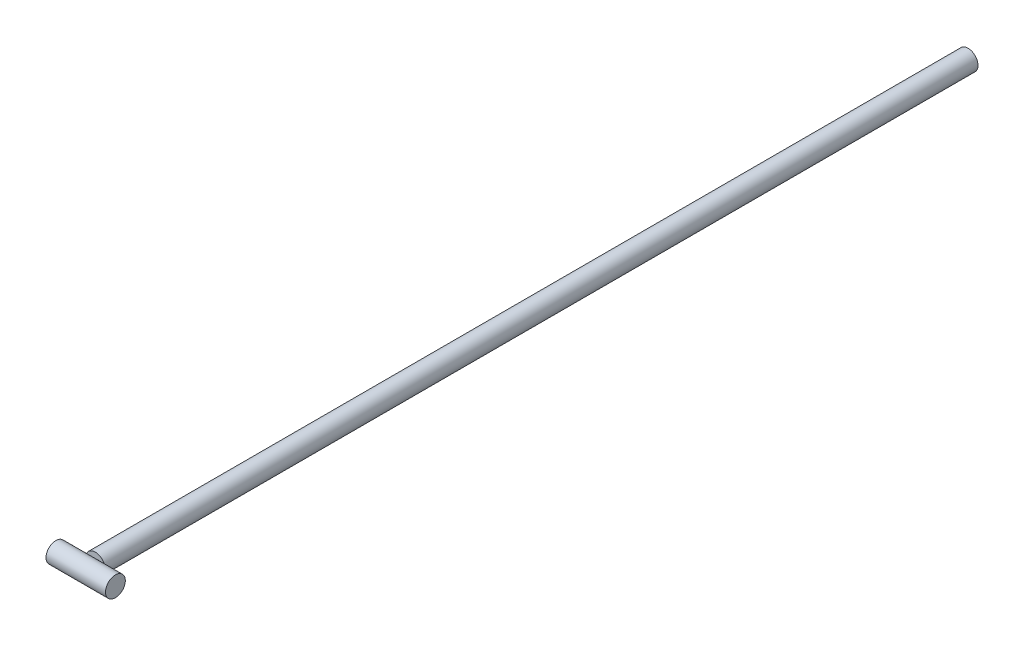
ISO-10303-21;
HEADER;
FILE_DESCRIPTION(('STEP AP214'),'2;1');
FILE_NAME('part.step','',(''),(''),'','','');
FILE_SCHEMA(('AUTOMOTIVE_DESIGN { 1 0 10303 214 1 1 1 1 }'));
ENDSEC;
DATA;
#1=APPLICATION_CONTEXT('core data for automotive mechanical design processes');
#2=APPLICATION_PROTOCOL_DEFINITION('international standard','automotive_design',2000,#1);
#3=PRODUCT_CONTEXT('',#1,'mechanical');
#4=PRODUCT('Part','Part','',(#3));
#5=PRODUCT_RELATED_PRODUCT_CATEGORY('part','',(#4));
#6=PRODUCT_DEFINITION_FORMATION('','',#4);
#7=PRODUCT_DEFINITION_CONTEXT('part definition',#1,'design');
#8=PRODUCT_DEFINITION('design','',#6,#7);
#9=PRODUCT_DEFINITION_SHAPE('','',#8);
#10=(LENGTH_UNIT() NAMED_UNIT(*) SI_UNIT(.MILLI.,.METRE.));
#11=(NAMED_UNIT(*) PLANE_ANGLE_UNIT() SI_UNIT($,.RADIAN.));
#12=(NAMED_UNIT(*) SI_UNIT($,.STERADIAN.) SOLID_ANGLE_UNIT());
#13=UNCERTAINTY_MEASURE_WITH_UNIT(LENGTH_MEASURE(1.E-05),#10,'distance_accuracy_value','');
#14=(GEOMETRIC_REPRESENTATION_CONTEXT(3) GLOBAL_UNCERTAINTY_ASSIGNED_CONTEXT((#13)) GLOBAL_UNIT_ASSIGNED_CONTEXT((#10,
#11,#12)) REPRESENTATION_CONTEXT('',''));
#15=CARTESIAN_POINT('',(0.,0.,0.));
#16=DIRECTION('',(0.,0.,1.));
#17=DIRECTION('',(1.,0.,0.));
#18=AXIS2_PLACEMENT_3D('',#15,#16,#17);
#19=CARTESIAN_POINT('',(0.,0.,110.));
#20=DIRECTION('',(0.,0.,1.));
#21=DIRECTION('',(1.,0.,0.));
#22=AXIS2_PLACEMENT_3D('',#19,#20,#21);
#23=PLANE('',#22);
#24=DIRECTION('',(-1.,0.,0.));
#25=VECTOR('',#24,1.);
#26=CARTESIAN_POINT('',(7.5,-0.542279974485531,110.));
#27=LINE('',#26,#25);
#28=CARTESIAN_POINT('',(2.44047791001516,-0.542279974485531,110.));
#29=VERTEX_POINT('',#28);
#30=CARTESIAN_POINT('',(-2.44047791001516,-0.54227997448554,110.));
#31=VERTEX_POINT('',#30);
#32=EDGE_CURVE('E47',#29,#31,#27,.T.);
#33=ORIENTED_EDGE('',*,*,#32,.T.);
#34=CARTESIAN_POINT('',(0.,0.,110.));
#35=DIRECTION('',(0.,0.,1.));
#36=DIRECTION('',(1.,0.,0.));
#37=AXIS2_PLACEMENT_3D('',#34,#35,#36);
#38=CIRCLE('',#37,2.5);
#39=EDGE_CURVE('E60',#31,#29,#38,.T.);
#40=ORIENTED_EDGE('',*,*,#39,.T.);
#41=EDGE_LOOP('',(#33,#40));
#42=FACE_BOUND('',#41,.T.);
#43=ADVANCED_FACE('F39',(#42),#23,.T.);
#44=CARTESIAN_POINT('',(0.,0.,110.));
#45=DIRECTION('',(0.,0.,-1.));
#46=DIRECTION('',(-1.,0.,0.));
#47=AXIS2_PLACEMENT_3D('',#44,#45,#46);
#48=CYLINDRICAL_SURFACE('',#47,2.5);
#49=CARTESIAN_POINT('',(0.,0.,-110.));
#50=DIRECTION('',(0.,0.,1.));
#51=DIRECTION('',(1.,0.,0.));
#52=AXIS2_PLACEMENT_3D('',#49,#50,#51);
#53=CIRCLE('',#52,2.5);
#54=CARTESIAN_POINT('',(2.5,0.,-110.));
#55=VERTEX_POINT('',#54);
#56=EDGE_CURVE('E79',#55,#55,#53,.T.);
#57=ORIENTED_EDGE('',*,*,#56,.T.);
#58=EDGE_LOOP('',(#57));
#59=FACE_BOUND('',#58,.T.);
#60=ORIENTED_EDGE('',*,*,#39,.F.);
#61=CARTESIAN_POINT('',(0.,0.,112.440477910015));
#62=DIRECTION('',(0.707106781186547,0.,-0.707106781186547));
#63=DIRECTION('',(-0.707106781186547,0.,-0.707106781186547));
#64=AXIS2_PLACEMENT_3D('',#61,#62,#63);
#65=ELLIPSE('',#64,3.53553390593273,2.5);
#66=CARTESIAN_POINT('',(-2.44047791001516,0.542279974485531,110.));
#67=VERTEX_POINT('',#66);
#68=EDGE_CURVE('E68',#31,#67,#65,.T.);
#69=ORIENTED_EDGE('',*,*,#68,.T.);
#70=CARTESIAN_POINT('',(2.44047791001516,0.54227997448554,110.));
#71=VERTEX_POINT('',#70);
#72=EDGE_CURVE('E73',#71,#67,#38,.T.);
#73=ORIENTED_EDGE('',*,*,#72,.F.);
#74=CARTESIAN_POINT('',(0.,0.,112.440477910015));
#75=DIRECTION('',(-0.707106781186547,0.,-0.707106781186547));
#76=DIRECTION('',(0.707106781186547,0.,-0.707106781186547));
#77=AXIS2_PLACEMENT_3D('',#74,#75,#76);
#78=ELLIPSE('',#77,3.53553390593273,2.5);
#79=EDGE_CURVE('E54',#29,#71,#78,.F.);
#80=ORIENTED_EDGE('',*,*,#79,.F.);
#81=EDGE_LOOP('',(#60,#69,#73,#80));
#82=FACE_BOUND('',#81,.T.);
#83=ADVANCED_FACE('F41',(#59,#82),#48,.T.);
#84=ORIENTED_EDGE('',*,*,#72,.T.);
#85=DIRECTION('',(-1.,0.,0.));
#86=VECTOR('',#85,1.);
#87=CARTESIAN_POINT('',(7.5,0.542279974485531,110.));
#88=LINE('',#87,#86);
#89=EDGE_CURVE('E11',#67,#71,#88,.F.);
#90=ORIENTED_EDGE('',*,*,#89,.T.);
#91=EDGE_LOOP('',(#84,#90));
#92=FACE_BOUND('',#91,.T.);
#93=ADVANCED_FACE('F77',(#92),#23,.T.);
#94=CARTESIAN_POINT('',(0.,0.,-110.));
#95=DIRECTION('',(0.,0.,1.));
#96=DIRECTION('',(1.,0.,0.));
#97=AXIS2_PLACEMENT_3D('',#94,#95,#96);
#98=PLANE('',#97);
#99=ORIENTED_EDGE('',*,*,#56,.F.);
#100=EDGE_LOOP('',(#99));
#101=FACE_BOUND('',#100,.T.);
#102=ADVANCED_FACE('F110',(#101),#98,.F.);
#103=CARTESIAN_POINT('',(7.5,0.,112.440477910015));
#104=DIRECTION('',(-1.,0.,0.));
#105=DIRECTION('',(0.,0.,1.));
#106=AXIS2_PLACEMENT_3D('',#103,#104,#105);
#107=CYLINDRICAL_SURFACE('',#106,2.5);
#108=ORIENTED_EDGE('',*,*,#89,.F.);
#109=ORIENTED_EDGE('',*,*,#68,.F.);
#110=ORIENTED_EDGE('',*,*,#32,.F.);
#111=ORIENTED_EDGE('',*,*,#79,.T.);
#112=EDGE_LOOP('',(#108,#109,#110,#111));
#113=FACE_BOUND('',#112,.T.);
#114=CARTESIAN_POINT('',(7.5,0.,112.440477910015));
#115=DIRECTION('',(1.,0.,0.));
#116=DIRECTION('',(0.,0.,-1.));
#117=AXIS2_PLACEMENT_3D('',#114,#115,#116);
#118=CIRCLE('',#117,2.5);
#119=CARTESIAN_POINT('',(7.5,0.,109.940477910015));
#120=VERTEX_POINT('',#119);
#121=EDGE_CURVE('E74',#120,#120,#118,.T.);
#122=ORIENTED_EDGE('',*,*,#121,.F.);
#123=EDGE_LOOP('',(#122));
#124=FACE_BOUND('',#123,.T.);
#125=CARTESIAN_POINT('',(-7.5,0.,112.440477910015));
#126=DIRECTION('',(1.,0.,0.));
#127=DIRECTION('',(0.,0.,-1.));
#128=AXIS2_PLACEMENT_3D('',#125,#126,#127);
#129=CIRCLE('',#128,2.5);
#130=CARTESIAN_POINT('',(-7.5,0.,109.940477910015));
#131=VERTEX_POINT('',#130);
#132=EDGE_CURVE('E75',#131,#131,#129,.T.);
#133=ORIENTED_EDGE('',*,*,#132,.T.);
#134=EDGE_LOOP('',(#133));
#135=FACE_BOUND('',#134,.T.);
#136=ADVANCED_FACE('F66',(#113,#124,#135),#107,.T.);
#137=CARTESIAN_POINT('',(7.5,0.,112.440477910015));
#138=DIRECTION('',(1.,0.,0.));
#139=DIRECTION('',(0.,0.,-1.));
#140=AXIS2_PLACEMENT_3D('',#137,#138,#139);
#141=PLANE('',#140);
#142=ORIENTED_EDGE('',*,*,#121,.T.);
#143=EDGE_LOOP('',(#142));
#144=FACE_BOUND('',#143,.T.);
#145=ADVANCED_FACE('F96',(#144),#141,.T.);
#146=CARTESIAN_POINT('',(-7.5,0.,112.440477910015));
#147=DIRECTION('',(-1.,0.,0.));
#148=DIRECTION('',(0.,0.,-1.));
#149=AXIS2_PLACEMENT_3D('',#146,#147,#148);
#150=PLANE('',#149);
#151=ORIENTED_EDGE('',*,*,#132,.F.);
#152=EDGE_LOOP('',(#151));
#153=FACE_BOUND('',#152,.T.);
#154=ADVANCED_FACE('F94',(#153),#150,.T.);
#155=CLOSED_SHELL('',(#43,#83,#93,#102,#136,#145,#154));
#156=MANIFOLD_SOLID_BREP('B2',#155);
#157=ADVANCED_BREP_SHAPE_REPRESENTATION('',(#18,#156),#14);
#158=SHAPE_DEFINITION_REPRESENTATION(#9,#157);
ENDSEC;
END-ISO-10303-21;
